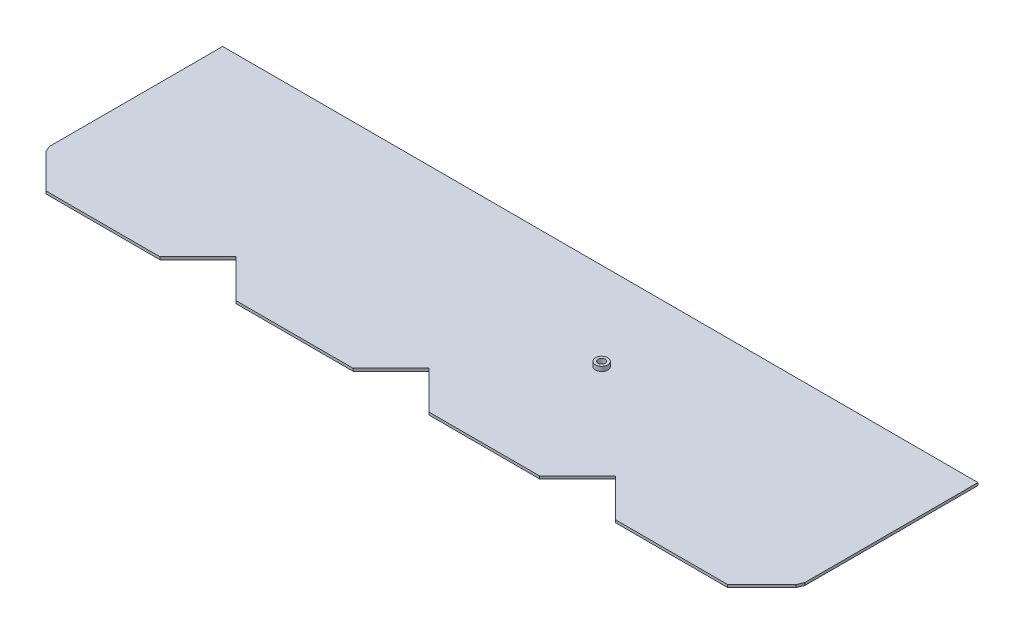
ISO-10303-21;
HEADER;
FILE_DESCRIPTION(('STEP AP214'),'2;1');
FILE_NAME('part.step','',(''),(''),'','','');
FILE_SCHEMA(('AUTOMOTIVE_DESIGN { 1 0 10303 214 1 1 1 1 }'));
ENDSEC;
DATA;
#1=APPLICATION_CONTEXT('core data for automotive mechanical design processes');
#2=APPLICATION_PROTOCOL_DEFINITION('international standard','automotive_design',2000,#1);
#3=PRODUCT_CONTEXT('',#1,'mechanical');
#4=PRODUCT('Part','Part','',(#3));
#5=PRODUCT_RELATED_PRODUCT_CATEGORY('part','',(#4));
#6=PRODUCT_DEFINITION_FORMATION('','',#4);
#7=PRODUCT_DEFINITION_CONTEXT('part definition',#1,'design');
#8=PRODUCT_DEFINITION('design','',#6,#7);
#9=PRODUCT_DEFINITION_SHAPE('','',#8);
#10=(LENGTH_UNIT() NAMED_UNIT(*) SI_UNIT(.MILLI.,.METRE.));
#11=(NAMED_UNIT(*) PLANE_ANGLE_UNIT() SI_UNIT($,.RADIAN.));
#12=(NAMED_UNIT(*) SI_UNIT($,.STERADIAN.) SOLID_ANGLE_UNIT());
#13=UNCERTAINTY_MEASURE_WITH_UNIT(LENGTH_MEASURE(1.E-05),#10,'distance_accuracy_value','');
#14=(GEOMETRIC_REPRESENTATION_CONTEXT(3) GLOBAL_UNCERTAINTY_ASSIGNED_CONTEXT((#13)) GLOBAL_UNIT_ASSIGNED_CONTEXT((#10,
#11,#12)) REPRESENTATION_CONTEXT('',''));
#15=CARTESIAN_POINT('',(0.,0.,0.));
#16=DIRECTION('',(0.,0.,1.));
#17=DIRECTION('',(1.,0.,0.));
#18=AXIS2_PLACEMENT_3D('',#15,#16,#17);
#19=CARTESIAN_POINT('',(0.,53.505408388521,50.));
#20=DIRECTION('',(0.,1.,0.));
#21=DIRECTION('',(0.,0.,1.));
#22=AXIS2_PLACEMENT_3D('',#19,#20,#21);
#23=PLANE('',#22);
#24=DIRECTION('',(-0.707106781186546,0.,0.707106781186549));
#25=VECTOR('',#24,1.);
#26=CARTESIAN_POINT('',(76.0160364478255,53.5054083885212,80.2466804827887));
#27=LINE('',#26,#25);
#28=CARTESIAN_POINT('',(107.044907195132,53.505408388521,49.2178097354824));
#29=VERTEX_POINT('',#28);
#30=CARTESIAN_POINT('',(96.4139605198139,53.505408388521,59.8487564108002));
#31=VERTEX_POINT('',#30);
#32=EDGE_CURVE('E473',#29,#31,#27,.T.);
#33=ORIENTED_EDGE('',*,*,#32,.F.);
#34=DIRECTION('',(-0.707106781186549,0.,-0.707106781186546));
#35=VECTOR('',#34,1.);
#36=CARTESIAN_POINT('',(112.79427374815,53.505408388521,54.9671762885009));
#37=LINE('',#36,#35);
#38=CARTESIAN_POINT('',(117.675853870449,53.505408388521,59.8487564107998));
#39=VERTEX_POINT('',#38);
#40=EDGE_CURVE('E414',#39,#29,#37,.T.);
#41=ORIENTED_EDGE('',*,*,#40,.F.);
#42=DIRECTION('',(1.,0.,0.));
#43=VECTOR('',#42,1.);
#44=CARTESIAN_POINT('',(107.912693625851,53.505408388521,59.8487564107998));
#45=LINE('',#44,#43);
#46=CARTESIAN_POINT('',(149.159335683654,53.505408388521,59.8487564107998));
#47=VERTEX_POINT('',#46);
#48=EDGE_CURVE('E417',#39,#47,#45,.T.);
#49=ORIENTED_EDGE('',*,*,#48,.T.);
#50=DIRECTION('',(-0.707106781186548,0.,0.707106781186547));
#51=VECTOR('',#50,1.);
#52=CARTESIAN_POINT('',(128.536014654753,53.5054083885211,80.4720774397011));
#53=LINE('',#52,#51);
#54=CARTESIAN_POINT('',(158.745719232882,53.505408388521,50.262372861486));
#55=VERTEX_POINT('',#54);
#56=EDGE_CURVE('E400',#55,#47,#53,.T.);
#57=ORIENTED_EDGE('',*,*,#56,.F.);
#58=DIRECTION('',(0.390683053656587,0.,-0.920525258526655));
#59=VECTOR('',#58,1.);
#60=CARTESIAN_POINT('',(158.745719232882,53.505408388521,50.262372861486));
#61=LINE('',#60,#59);
#62=CARTESIAN_POINT('',(159.482319232811,53.505408388521,48.5268000000092));
#63=VERTEX_POINT('',#62);
#64=EDGE_CURVE('E405',#55,#63,#61,.T.);
#65=ORIENTED_EDGE('',*,*,#64,.T.);
#66=DIRECTION('',(0.,0.,-1.));
#67=VECTOR('',#66,1.);
#68=CARTESIAN_POINT('',(159.482319232915,53.505408388521,49.9999999999994));
#69=LINE('',#68,#67);
#70=CARTESIAN_POINT('',(159.482319232915,53.505408388521,-6.52256026967279E-13));
#71=VERTEX_POINT('',#70);
#72=EDGE_CURVE('E403',#63,#71,#69,.T.);
#73=ORIENTED_EDGE('',*,*,#72,.T.);
#74=DIRECTION('',(1.,0.,0.));
#75=VECTOR('',#74,1.);
#76=CARTESIAN_POINT('',(54.144912375837,53.505408388521,-2.15105711021124E-13));
#77=LINE('',#76,#75);
#78=CARTESIAN_POINT('',(-52.2945812499967,53.505408388521,0.));
#79=VERTEX_POINT('',#78);
#80=EDGE_CURVE('E229',#79,#71,#77,.T.);
#81=ORIENTED_EDGE('',*,*,#80,.F.);
#82=DIRECTION('',(0.,0.,-1.));
#83=VECTOR('',#82,1.);
#84=CARTESIAN_POINT('',(-52.2945812499967,53.505408388521,50.));
#85=LINE('',#84,#83);
#86=CARTESIAN_POINT('',(-52.2945812500044,53.505408388521,48.5268000000098));
#87=VERTEX_POINT('',#86);
#88=EDGE_CURVE('E446',#87,#79,#85,.T.);
#89=ORIENTED_EDGE('',*,*,#88,.F.);
#90=DIRECTION('',(0.390683053641917,0.,0.920525258532881));
#91=VECTOR('',#90,1.);
#92=CARTESIAN_POINT('',(-52.2945812500044,53.505408388521,48.5268000000099));
#93=LINE('',#92,#91);
#94=CARTESIAN_POINT('',(-51.5579812501082,53.505408388521,50.2623728614867));
#95=VERTEX_POINT('',#94);
#96=EDGE_CURVE('E449',#87,#95,#93,.T.);
#97=ORIENTED_EDGE('',*,*,#96,.T.);
#98=DIRECTION('',(-0.707106781186547,0.,-0.707106781186548));
#99=VECTOR('',#98,1.);
#100=CARTESIAN_POINT('',(-47.1330894753917,53.505408388521,54.6872646361954));
#101=LINE('',#100,#99);
#102=CARTESIAN_POINT('',(-41.9715977007867,53.505408388521,59.8487564108004));
#103=VERTEX_POINT('',#102);
#104=EDGE_CURVE('E466',#103,#95,#101,.T.);
#105=ORIENTED_EDGE('',*,*,#104,.F.);
#106=DIRECTION('',(1.,0.,0.));
#107=VECTOR('',#106,1.);
#108=CARTESIAN_POINT('',(-52.2945812499967,53.505408388521,59.8487564108004));
#109=LINE('',#108,#107);
#110=CARTESIAN_POINT('',(-10.0255331060495,53.505408388521,59.8487564108004));
#111=VERTEX_POINT('',#110);
#112=EDGE_CURVE('E458',#103,#111,#109,.T.);
#113=ORIENTED_EDGE('',*,*,#112,.T.);
#114=DIRECTION('',(-0.707106781186546,0.,0.707106781186549));
#115=VECTOR('',#114,1.);
#116=CARTESIAN_POINT('',(-31.160057178023,53.5054083885212,80.983280482774));
#117=LINE('',#116,#115);
#118=CARTESIAN_POINT('',(0.605413569294166,53.505408388521,49.2178097354568));
#119=VERTEX_POINT('',#118);
#120=EDGE_CURVE('E461',#119,#111,#117,.T.);
#121=ORIENTED_EDGE('',*,*,#120,.F.);
#122=DIRECTION('',(-0.707106781186549,0.,-0.707106781186546));
#123=VECTOR('',#122,1.);
#124=CARTESIAN_POINT('',(6.35478012231893,53.505408388521,54.9671762884815));
#125=LINE('',#124,#123);
#126=CARTESIAN_POINT('',(11.2363602446379,53.505408388521,59.8487564108004));
#127=VERTEX_POINT('',#126);
#128=EDGE_CURVE('E391',#127,#119,#125,.T.);
#129=ORIENTED_EDGE('',*,*,#128,.F.);
#130=DIRECTION('',(1.,0.,0.));
#131=VECTOR('',#130,1.);
#132=CARTESIAN_POINT('',(1.4732,53.505408388521,59.8487564108004));
#133=LINE('',#132,#131);
#134=CARTESIAN_POINT('',(44.1193792697845,53.505408388521,59.8487564108004));
#135=VERTEX_POINT('',#134);
#136=EDGE_CURVE('E435',#127,#135,#133,.T.);
#137=ORIENTED_EDGE('',*,*,#136,.T.);
#138=DIRECTION('',(-0.707106781186544,0.,0.707106781186551));
#139=VECTOR('',#138,1.);
#140=CARTESIAN_POINT('',(22.7962896348924,53.5054083885212,81.1718460456927));
#141=LINE('',#140,#139);
#142=CARTESIAN_POINT('',(54.7503259451096,53.505408388521,49.2178097354752));
#143=VERTEX_POINT('',#142);
#144=EDGE_CURVE('E433',#143,#135,#141,.T.);
#145=ORIENTED_EDGE('',*,*,#144,.F.);
#146=DIRECTION('',(-0.707106781186551,0.,-0.707106781186544));
#147=VECTOR('',#146,1.);
#148=CARTESIAN_POINT('',(60.4996924981358,53.505408388521,54.9671762885014));
#149=LINE('',#148,#147);
#150=CARTESIAN_POINT('',(65.3812726204347,53.505408388521,59.8487564108002));
#151=VERTEX_POINT('',#150);
#152=EDGE_CURVE('E480',#151,#143,#149,.T.);
#153=ORIENTED_EDGE('',*,*,#152,.F.);
#154=DIRECTION('',(1.,0.,0.));
#155=VECTOR('',#154,1.);
#156=CARTESIAN_POINT('',(55.618112375837,53.505408388521,59.8487564108002));
#157=LINE('',#156,#155);
#158=EDGE_CURVE('E483',#151,#31,#157,.T.);
#159=ORIENTED_EDGE('',*,*,#158,.T.);
#160=EDGE_LOOP('',(#33,#41,#49,#57,#65,#73,#81,#89,#97,#105,#113,#121,#129,#137,#145,#153,#159));
#161=FACE_BOUND('',#160,.T.);
#162=CARTESIAN_POINT('',(78.5376608797119,53.505408388521,24.5770176248354));
#163=DIRECTION('',(0.,1.,0.));
#164=DIRECTION('',(0.,0.,-1.));
#165=AXIS2_PLACEMENT_3D('',#162,#163,#164);
#166=CIRCLE('',#165,1.7366);
#167=CARTESIAN_POINT('',(78.5376608797119,53.505408388521,22.8404176248354));
#168=VERTEX_POINT('',#167);
#169=EDGE_CURVE('E491',#168,#168,#166,.F.);
#170=ORIENTED_EDGE('',*,*,#169,.T.);
#171=EDGE_LOOP('',(#170));
#172=FACE_BOUND('',#171,.T.);
#173=ADVANCED_FACE('F221',(#161,#172),#23,.T.);
#174=CARTESIAN_POINT('',(54.144912375837,52.768808388521,49.9999999999998));
#175=DIRECTION('',(0.,1.,0.));
#176=DIRECTION('',(0.,0.,-1.));
#177=AXIS2_PLACEMENT_3D('',#174,#175,#176);
#178=PLANE('',#177);
#179=DIRECTION('',(-0.707106781186549,0.,-0.707106781186546));
#180=VECTOR('',#179,1.);
#181=CARTESIAN_POINT('',(112.79427374815,52.768808388521,54.9671762885009));
#182=LINE('',#181,#180);
#183=CARTESIAN_POINT('',(117.675853870449,52.768808388521,59.8487564107998));
#184=VERTEX_POINT('',#183);
#185=CARTESIAN_POINT('',(107.044907195132,52.768808388521,49.2178097354824));
#186=VERTEX_POINT('',#185);
#187=EDGE_CURVE('E352',#184,#186,#182,.T.);
#188=ORIENTED_EDGE('',*,*,#187,.T.);
#189=DIRECTION('',(-0.707106781186546,0.,0.707106781186549));
#190=VECTOR('',#189,1.);
#191=CARTESIAN_POINT('',(76.0160364478255,52.7688083885212,80.2466804827887));
#192=LINE('',#191,#190);
#193=CARTESIAN_POINT('',(96.4139605198139,52.7688083885211,59.8487564108002));
#194=VERTEX_POINT('',#193);
#195=EDGE_CURVE('E478',#186,#194,#192,.T.);
#196=ORIENTED_EDGE('',*,*,#195,.T.);
#197=DIRECTION('',(1.,0.,0.));
#198=VECTOR('',#197,1.);
#199=CARTESIAN_POINT('',(55.618112375837,52.768808388521,59.8487564108002));
#200=LINE('',#199,#198);
#201=CARTESIAN_POINT('',(65.3812726204347,52.768808388521,59.8487564108002));
#202=VERTEX_POINT('',#201);
#203=EDGE_CURVE('E485',#202,#194,#200,.T.);
#204=ORIENTED_EDGE('',*,*,#203,.F.);
#205=DIRECTION('',(-0.707106781186551,0.,-0.707106781186544));
#206=VECTOR('',#205,1.);
#207=CARTESIAN_POINT('',(60.4996924981358,52.768808388521,54.9671762885014));
#208=LINE('',#207,#206);
#209=CARTESIAN_POINT('',(54.7503259451096,52.768808388521,49.2178097354752));
#210=VERTEX_POINT('',#209);
#211=EDGE_CURVE('E475',#202,#210,#208,.T.);
#212=ORIENTED_EDGE('',*,*,#211,.T.);
#213=DIRECTION('',(-0.707106781186544,0.,0.707106781186551));
#214=VECTOR('',#213,1.);
#215=CARTESIAN_POINT('',(22.7962896348924,52.7688083885212,81.1718460456927));
#216=LINE('',#215,#214);
#217=CARTESIAN_POINT('',(44.1193792697845,52.7688083885211,59.8487564108004));
#218=VERTEX_POINT('',#217);
#219=EDGE_CURVE('E386',#210,#218,#216,.T.);
#220=ORIENTED_EDGE('',*,*,#219,.T.);
#221=DIRECTION('',(1.,0.,0.));
#222=VECTOR('',#221,1.);
#223=CARTESIAN_POINT('',(1.4732,52.768808388521,59.8487564108004));
#224=LINE('',#223,#222);
#225=CARTESIAN_POINT('',(11.2363602446379,52.768808388521,59.8487564108004));
#226=VERTEX_POINT('',#225);
#227=EDGE_CURVE('E383',#226,#218,#224,.T.);
#228=ORIENTED_EDGE('',*,*,#227,.F.);
#229=DIRECTION('',(-0.707106781186549,0.,-0.707106781186546));
#230=VECTOR('',#229,1.);
#231=CARTESIAN_POINT('',(6.35478012231893,52.768808388521,54.9671762884815));
#232=LINE('',#231,#230);
#233=CARTESIAN_POINT('',(0.605413569294166,52.768808388521,49.2178097354568));
#234=VERTEX_POINT('',#233);
#235=EDGE_CURVE('E379',#226,#234,#232,.T.);
#236=ORIENTED_EDGE('',*,*,#235,.T.);
#237=DIRECTION('',(-0.707106781186546,0.,0.707106781186549));
#238=VECTOR('',#237,1.);
#239=CARTESIAN_POINT('',(-31.160057178023,52.7688083885212,80.983280482774));
#240=LINE('',#239,#238);
#241=CARTESIAN_POINT('',(-10.0255331060495,52.768808388521,59.8487564108004));
#242=VERTEX_POINT('',#241);
#243=EDGE_CURVE('E368',#234,#242,#240,.T.);
#244=ORIENTED_EDGE('',*,*,#243,.T.);
#245=DIRECTION('',(1.,0.,0.));
#246=VECTOR('',#245,1.);
#247=CARTESIAN_POINT('',(-52.2945812499967,52.768808388521,59.8487564108004));
#248=LINE('',#247,#246);
#249=CARTESIAN_POINT('',(-41.9715977007867,52.768808388521,59.8487564108004));
#250=VERTEX_POINT('',#249);
#251=EDGE_CURVE('E468',#250,#242,#248,.T.);
#252=ORIENTED_EDGE('',*,*,#251,.F.);
#253=DIRECTION('',(-0.707106781186547,0.,-0.707106781186548));
#254=VECTOR('',#253,1.);
#255=CARTESIAN_POINT('',(-47.1330894753917,52.768808388521,54.6872646361954));
#256=LINE('',#255,#254);
#257=CARTESIAN_POINT('',(-51.5579812501004,52.768808388521,50.2623728614867));
#258=VERTEX_POINT('',#257);
#259=EDGE_CURVE('E374',#250,#258,#256,.T.);
#260=ORIENTED_EDGE('',*,*,#259,.T.);
#261=DIRECTION('',(0.390683053641917,0.,0.920525258532881));
#262=VECTOR('',#261,1.);
#263=CARTESIAN_POINT('',(-52.2945812500044,52.768808388521,48.5268000000099));
#264=LINE('',#263,#262);
#265=CARTESIAN_POINT('',(-52.2945812500044,52.768808388521,48.5268000000098));
#266=VERTEX_POINT('',#265);
#267=EDGE_CURVE('E453',#266,#258,#264,.T.);
#268=ORIENTED_EDGE('',*,*,#267,.F.);
#269=DIRECTION('',(0.,0.,-1.));
#270=VECTOR('',#269,1.);
#271=CARTESIAN_POINT('',(-52.2945812499967,52.768808388521,50.));
#272=LINE('',#271,#270);
#273=CARTESIAN_POINT('',(-52.2945812499967,52.768808388521,0.));
#274=VERTEX_POINT('',#273);
#275=EDGE_CURVE('E440',#266,#274,#272,.T.);
#276=ORIENTED_EDGE('',*,*,#275,.T.);
#277=DIRECTION('',(-1.,0.,0.));
#278=VECTOR('',#277,1.);
#279=CARTESIAN_POINT('',(54.144912375837,52.768808388521,-2.15105711021124E-13));
#280=LINE('',#279,#278);
#281=CARTESIAN_POINT('',(159.482319232915,52.768808388521,-6.52256026967279E-13));
#282=VERTEX_POINT('',#281);
#283=EDGE_CURVE('E12',#274,#282,#280,.F.);
#284=ORIENTED_EDGE('',*,*,#283,.T.);
#285=DIRECTION('',(0.,0.,-1.));
#286=VECTOR('',#285,1.);
#287=CARTESIAN_POINT('',(159.482319232915,52.768808388521,49.9999999999994));
#288=LINE('',#287,#286);
#289=CARTESIAN_POINT('',(159.482319232811,52.768808388521,48.5268000000092));
#290=VERTEX_POINT('',#289);
#291=EDGE_CURVE('E408',#290,#282,#288,.T.);
#292=ORIENTED_EDGE('',*,*,#291,.F.);
#293=DIRECTION('',(0.390683053656587,0.,-0.920525258526655));
#294=VECTOR('',#293,1.);
#295=CARTESIAN_POINT('',(158.745719232882,52.768808388521,50.262372861486));
#296=LINE('',#295,#294);
#297=CARTESIAN_POINT('',(158.745719232968,52.768808388521,50.262372861486));
#298=VERTEX_POINT('',#297);
#299=EDGE_CURVE('E422',#298,#290,#296,.T.);
#300=ORIENTED_EDGE('',*,*,#299,.F.);
#301=DIRECTION('',(-0.707106781186548,0.,0.707106781186547));
#302=VECTOR('',#301,1.);
#303=CARTESIAN_POINT('',(128.536014654753,52.7688083885211,80.4720774397011));
#304=LINE('',#303,#302);
#305=CARTESIAN_POINT('',(149.159335683654,52.768808388521,59.8487564107998));
#306=VERTEX_POINT('',#305);
#307=EDGE_CURVE('E341',#298,#306,#304,.T.);
#308=ORIENTED_EDGE('',*,*,#307,.T.);
#309=DIRECTION('',(1.,0.,0.));
#310=VECTOR('',#309,1.);
#311=CARTESIAN_POINT('',(107.912693625851,52.768808388521,59.8487564107998));
#312=LINE('',#311,#310);
#313=EDGE_CURVE('E426',#184,#306,#312,.T.);
#314=ORIENTED_EDGE('',*,*,#313,.F.);
#315=EDGE_LOOP('',(#188,#196,#204,#212,#220,#228,#236,#244,#252,#260,#268,#276,#284,#292,#300,
#308,#314));
#316=FACE_BOUND('',#315,.T.);
#317=CARTESIAN_POINT('',(78.5376608797119,52.768808388521,24.5770176248354));
#318=DIRECTION('',(0.,1.,0.));
#319=DIRECTION('',(0.,0.,-1.));
#320=AXIS2_PLACEMENT_3D('',#317,#318,#319);
#321=CIRCLE('',#320,1.);
#322=CARTESIAN_POINT('',(78.5376608797119,52.768808388521,23.5770176248354));
#323=VERTEX_POINT('',#322);
#324=EDGE_CURVE('E496',#323,#323,#321,.T.);
#325=ORIENTED_EDGE('',*,*,#324,.T.);
#326=EDGE_LOOP('',(#325));
#327=FACE_BOUND('',#326,.T.);
#328=ADVANCED_FACE('F380',(#316,#327),#178,.F.);
#329=CARTESIAN_POINT('',(106.913720764358,52.032208388521,-2.15105711021124E-13));
#330=DIRECTION('',(0.,0.,-1.));
#331=DIRECTION('',(0.,-1.,0.));
#332=AXIS2_PLACEMENT_3D('',#329,#330,#331);
#333=PLANE('',#332);
#334=ORIENTED_EDGE('',*,*,#80,.T.);
#335=DIRECTION('',(0.,-1.,0.));
#336=VECTOR('',#335,1.);
#337=CARTESIAN_POINT('',(159.482319232915,53.505408388521,-6.52256026967279E-13));
#338=LINE('',#337,#336);
#339=EDGE_CURVE('E401',#71,#282,#338,.T.);
#340=ORIENTED_EDGE('',*,*,#339,.T.);
#341=ORIENTED_EDGE('',*,*,#283,.F.);
#342=DIRECTION('',(0.,1.,0.));
#343=VECTOR('',#342,1.);
#344=CARTESIAN_POINT('',(-52.2945812499967,52.768808388521,0.));
#345=LINE('',#344,#343);
#346=EDGE_CURVE('E385',#274,#79,#345,.T.);
#347=ORIENTED_EDGE('',*,*,#346,.T.);
#348=EDGE_LOOP('',(#334,#340,#341,#347));
#349=FACE_BOUND('',#348,.T.);
#350=ADVANCED_FACE('F504',(#349),#333,.T.);
#351=CARTESIAN_POINT('',(78.5376608797119,54.768808388521,24.5770176248354));
#352=DIRECTION('',(0.,-1.,0.));
#353=DIRECTION('',(0.,0.,1.));
#354=AXIS2_PLACEMENT_3D('',#351,#352,#353);
#355=CYLINDRICAL_SURFACE('',#354,1.);
#356=ORIENTED_EDGE('',*,*,#324,.F.);
#357=EDGE_LOOP('',(#356));
#358=FACE_BOUND('',#357,.T.);
#359=CARTESIAN_POINT('',(78.5376608797119,54.768808388521,24.5770176248354));
#360=DIRECTION('',(0.,1.,0.));
#361=DIRECTION('',(0.,0.,-1.));
#362=AXIS2_PLACEMENT_3D('',#359,#360,#361);
#363=CIRCLE('',#362,1.);
#364=CARTESIAN_POINT('',(78.5376608797119,54.768808388521,23.5770176248354));
#365=VERTEX_POINT('',#364);
#366=EDGE_CURVE('E488',#365,#365,#363,.T.);
#367=ORIENTED_EDGE('',*,*,#366,.T.);
#368=EDGE_LOOP('',(#367));
#369=FACE_BOUND('',#368,.T.);
#370=ADVANCED_FACE('F500',(#358,#369),#355,.F.);
#371=CARTESIAN_POINT('',(78.5376608797119,54.768808388521,24.5770176248354));
#372=DIRECTION('',(0.,-1.,0.));
#373=DIRECTION('',(0.,0.,1.));
#374=AXIS2_PLACEMENT_3D('',#371,#372,#373);
#375=PLANE('',#374);
#376=ORIENTED_EDGE('',*,*,#366,.F.);
#377=EDGE_LOOP('',(#376));
#378=FACE_BOUND('',#377,.T.);
#379=CARTESIAN_POINT('',(78.5376608797119,54.768808388521,24.5770176248354));
#380=DIRECTION('',(0.,-1.,0.));
#381=DIRECTION('',(0.,0.,1.));
#382=AXIS2_PLACEMENT_3D('',#379,#380,#381);
#383=CIRCLE('',#382,1.7366);
#384=CARTESIAN_POINT('',(78.5376608797119,54.768808388521,26.3136176248354));
#385=VERTEX_POINT('',#384);
#386=EDGE_CURVE('E472',#385,#385,#383,.F.);
#387=ORIENTED_EDGE('',*,*,#386,.T.);
#388=EDGE_LOOP('',(#387));
#389=FACE_BOUND('',#388,.T.);
#390=ADVANCED_FACE('F503',(#378,#389),#375,.F.);
#391=CARTESIAN_POINT('',(78.5376608797119,54.768808388521,24.5770176248354));
#392=DIRECTION('',(0.,-1.,0.));
#393=DIRECTION('',(0.,0.,1.));
#394=AXIS2_PLACEMENT_3D('',#391,#392,#393);
#395=CYLINDRICAL_SURFACE('',#394,1.7366);
#396=ORIENTED_EDGE('',*,*,#169,.F.);
#397=EDGE_LOOP('',(#396));
#398=FACE_BOUND('',#397,.T.);
#399=ORIENTED_EDGE('',*,*,#386,.F.);
#400=EDGE_LOOP('',(#399));
#401=FACE_BOUND('',#400,.T.);
#402=ADVANCED_FACE('F510',(#398,#401),#395,.T.);
#403=CARTESIAN_POINT('',(55.618112375837,53.505408388521,59.8487564108002));
#404=DIRECTION('',(0.,0.,-1.));
#405=DIRECTION('',(1.,0.,0.));
#406=AXIS2_PLACEMENT_3D('',#403,#404,#405);
#407=PLANE('',#406);
#408=DIRECTION('',(0.,-1.,0.));
#409=VECTOR('',#408,1.);
#410=CARTESIAN_POINT('',(96.4139605198139,53.505408388521,59.8487564108002));
#411=LINE('',#410,#409);
#412=EDGE_CURVE('E237',#31,#194,#411,.T.);
#413=ORIENTED_EDGE('',*,*,#412,.F.);
#414=ORIENTED_EDGE('',*,*,#158,.F.);
#415=DIRECTION('',(0.,-1.,0.));
#416=VECTOR('',#415,1.);
#417=CARTESIAN_POINT('',(65.3812726204347,53.505408388521,59.8487564108002));
#418=LINE('',#417,#416);
#419=EDGE_CURVE('E248',#151,#202,#418,.T.);
#420=ORIENTED_EDGE('',*,*,#419,.T.);
#421=ORIENTED_EDGE('',*,*,#203,.T.);
#422=EDGE_LOOP('',(#413,#414,#420,#421));
#423=FACE_BOUND('',#422,.T.);
#424=ADVANCED_FACE('F515',(#423),#407,.F.);
#425=CARTESIAN_POINT('',(60.4996924981358,53.505408388521,54.9671762885014));
#426=DIRECTION('',(-0.707106781186544,0.,0.707106781186551));
#427=DIRECTION('',(-0.707106781186551,0.,-0.707106781186544));
#428=AXIS2_PLACEMENT_3D('',#425,#426,#427);
#429=PLANE('',#428);
#430=ORIENTED_EDGE('',*,*,#419,.F.);
#431=ORIENTED_EDGE('',*,*,#152,.T.);
#432=DIRECTION('',(0.,1.,0.));
#433=VECTOR('',#432,1.);
#434=CARTESIAN_POINT('',(54.7503259451096,52.768808388521,49.2178097354752));
#435=LINE('',#434,#433);
#436=EDGE_CURVE('E392',#210,#143,#435,.T.);
#437=ORIENTED_EDGE('',*,*,#436,.F.);
#438=ORIENTED_EDGE('',*,*,#211,.F.);
#439=EDGE_LOOP('',(#430,#431,#437,#438));
#440=FACE_BOUND('',#439,.T.);
#441=ADVANCED_FACE('F521',(#440),#429,.T.);
#442=CARTESIAN_POINT('',(76.0160364478255,53.5054083885212,80.2466804827887));
#443=DIRECTION('',(0.707106781186549,0.,0.707106781186546));
#444=DIRECTION('',(-0.707106781186546,0.,0.707106781186549));
#445=AXIS2_PLACEMENT_3D('',#442,#443,#444);
#446=PLANE('',#445);
#447=ORIENTED_EDGE('',*,*,#32,.T.);
#448=ORIENTED_EDGE('',*,*,#412,.T.);
#449=ORIENTED_EDGE('',*,*,#195,.F.);
#450=DIRECTION('',(0.,1.,0.));
#451=VECTOR('',#450,1.);
#452=CARTESIAN_POINT('',(107.044907195132,52.768808388521,49.2178097354824));
#453=LINE('',#452,#451);
#454=EDGE_CURVE('E395',#186,#29,#453,.T.);
#455=ORIENTED_EDGE('',*,*,#454,.T.);
#456=EDGE_LOOP('',(#447,#448,#449,#455));
#457=FACE_BOUND('',#456,.T.);
#458=ADVANCED_FACE('F538',(#457),#446,.T.);
#459=CARTESIAN_POINT('',(-52.2945812499967,53.505408388521,59.8487564108004));
#460=DIRECTION('',(0.,0.,-1.));
#461=DIRECTION('',(1.,0.,0.));
#462=AXIS2_PLACEMENT_3D('',#459,#460,#461);
#463=PLANE('',#462);
#464=DIRECTION('',(0.,-1.,0.));
#465=VECTOR('',#464,1.);
#466=CARTESIAN_POINT('',(-10.0255331060495,53.505408388521,59.8487564108004));
#467=LINE('',#466,#465);
#468=EDGE_CURVE('E304',#111,#242,#467,.T.);
#469=ORIENTED_EDGE('',*,*,#468,.F.);
#470=ORIENTED_EDGE('',*,*,#112,.F.);
#471=DIRECTION('',(0.,-1.,0.));
#472=VECTOR('',#471,1.);
#473=CARTESIAN_POINT('',(-41.9715977007867,53.505408388521,59.8487564108004));
#474=LINE('',#473,#472);
#475=EDGE_CURVE('E300',#103,#250,#474,.T.);
#476=ORIENTED_EDGE('',*,*,#475,.T.);
#477=ORIENTED_EDGE('',*,*,#251,.T.);
#478=EDGE_LOOP('',(#469,#470,#476,#477));
#479=FACE_BOUND('',#478,.T.);
#480=ADVANCED_FACE('F561',(#479),#463,.F.);
#481=CARTESIAN_POINT('',(-47.1330894753917,53.505408388521,54.6872646361954));
#482=DIRECTION('',(-0.707106781186548,0.,0.707106781186547));
#483=DIRECTION('',(-0.707106781186547,0.,-0.707106781186548));
#484=AXIS2_PLACEMENT_3D('',#481,#482,#483);
#485=PLANE('',#484);
#486=ORIENTED_EDGE('',*,*,#475,.F.);
#487=ORIENTED_EDGE('',*,*,#104,.T.);
#488=DIRECTION('',(0.,-1.,0.));
#489=VECTOR('',#488,1.);
#490=CARTESIAN_POINT('',(-51.5579812501004,53.505408388521,50.2623728614867));
#491=LINE('',#490,#489);
#492=EDGE_CURVE('E375',#95,#258,#491,.T.);
#493=ORIENTED_EDGE('',*,*,#492,.T.);
#494=ORIENTED_EDGE('',*,*,#259,.F.);
#495=EDGE_LOOP('',(#486,#487,#493,#494));
#496=FACE_BOUND('',#495,.T.);
#497=ADVANCED_FACE('F565',(#496),#485,.T.);
#498=CARTESIAN_POINT('',(-31.160057178023,53.5054083885212,80.983280482774));
#499=DIRECTION('',(0.707106781186549,0.,0.707106781186546));
#500=DIRECTION('',(-0.707106781186546,0.,0.707106781186549));
#501=AXIS2_PLACEMENT_3D('',#498,#499,#500);
#502=PLANE('',#501);
#503=ORIENTED_EDGE('',*,*,#120,.T.);
#504=ORIENTED_EDGE('',*,*,#468,.T.);
#505=ORIENTED_EDGE('',*,*,#243,.F.);
#506=DIRECTION('',(0.,1.,0.));
#507=VECTOR('',#506,1.);
#508=CARTESIAN_POINT('',(0.605413569294166,52.768808388521,49.2178097354568));
#509=LINE('',#508,#507);
#510=EDGE_CURVE('E373',#234,#119,#509,.T.);
#511=ORIENTED_EDGE('',*,*,#510,.T.);
#512=EDGE_LOOP('',(#503,#504,#505,#511));
#513=FACE_BOUND('',#512,.T.);
#514=ADVANCED_FACE('F371',(#513),#502,.T.);
#515=CARTESIAN_POINT('',(-52.2945812500044,53.137108388521,48.5268000000099));
#516=DIRECTION('',(-0.920525258532881,0.,0.390683053641917));
#517=DIRECTION('',(0.390683053641917,0.,0.920525258532881));
#518=AXIS2_PLACEMENT_3D('',#515,#516,#517);
#519=PLANE('',#518);
#520=DIRECTION('',(0.,-1.,0.));
#521=VECTOR('',#520,1.);
#522=CARTESIAN_POINT('',(-52.2945812500044,53.505408388521,48.5268000000098));
#523=LINE('',#522,#521);
#524=EDGE_CURVE('E456',#87,#266,#523,.T.);
#525=ORIENTED_EDGE('',*,*,#524,.T.);
#526=ORIENTED_EDGE('',*,*,#267,.T.);
#527=ORIENTED_EDGE('',*,*,#492,.F.);
#528=ORIENTED_EDGE('',*,*,#96,.F.);
#529=EDGE_LOOP('',(#525,#526,#527,#528));
#530=FACE_BOUND('',#529,.T.);
#531=ADVANCED_FACE('F578',(#530),#519,.T.);
#532=CARTESIAN_POINT('',(6.35478012231893,53.505408388521,54.9671762884815));
#533=DIRECTION('',(-0.707106781186546,0.,0.707106781186549));
#534=DIRECTION('',(-0.707106781186549,0.,-0.707106781186546));
#535=AXIS2_PLACEMENT_3D('',#532,#533,#534);
#536=PLANE('',#535);
#537=DIRECTION('',(0.,-1.,0.));
#538=VECTOR('',#537,1.);
#539=CARTESIAN_POINT('',(11.2363602446379,53.505408388521,59.8487564108004));
#540=LINE('',#539,#538);
#541=EDGE_CURVE('E444',#127,#226,#540,.T.);
#542=ORIENTED_EDGE('',*,*,#541,.F.);
#543=ORIENTED_EDGE('',*,*,#128,.T.);
#544=ORIENTED_EDGE('',*,*,#510,.F.);
#545=ORIENTED_EDGE('',*,*,#235,.F.);
#546=EDGE_LOOP('',(#542,#543,#544,#545));
#547=FACE_BOUND('',#546,.T.);
#548=ADVANCED_FACE('F389',(#547),#536,.T.);
#549=CARTESIAN_POINT('',(-52.2945812499967,52.768808388521,50.));
#550=DIRECTION('',(-1.,0.,0.));
#551=DIRECTION('',(0.,0.,-1.));
#552=AXIS2_PLACEMENT_3D('',#549,#550,#551);
#553=PLANE('',#552);
#554=ORIENTED_EDGE('',*,*,#275,.F.);
#555=ORIENTED_EDGE('',*,*,#524,.F.);
#556=ORIENTED_EDGE('',*,*,#88,.T.);
#557=ORIENTED_EDGE('',*,*,#346,.F.);
#558=EDGE_LOOP('',(#554,#555,#556,#557));
#559=FACE_BOUND('',#558,.T.);
#560=ADVANCED_FACE('F547',(#559),#553,.T.);
#561=CARTESIAN_POINT('',(1.4732,53.505408388521,59.8487564108004));
#562=DIRECTION('',(0.,0.,-1.));
#563=DIRECTION('',(1.,0.,0.));
#564=AXIS2_PLACEMENT_3D('',#561,#562,#563);
#565=PLANE('',#564);
#566=DIRECTION('',(0.,-1.,0.));
#567=VECTOR('',#566,1.);
#568=CARTESIAN_POINT('',(44.1193792697845,53.505408388521,59.8487564108004));
#569=LINE('',#568,#567);
#570=EDGE_CURVE('E259',#135,#218,#569,.T.);
#571=ORIENTED_EDGE('',*,*,#570,.F.);
#572=ORIENTED_EDGE('',*,*,#136,.F.);
#573=ORIENTED_EDGE('',*,*,#541,.T.);
#574=ORIENTED_EDGE('',*,*,#227,.T.);
#575=EDGE_LOOP('',(#571,#572,#573,#574));
#576=FACE_BOUND('',#575,.T.);
#577=ADVANCED_FACE('F545',(#576),#565,.F.);
#578=CARTESIAN_POINT('',(22.7962896348924,53.5054083885212,81.1718460456927));
#579=DIRECTION('',(0.707106781186551,0.,0.707106781186544));
#580=DIRECTION('',(-0.707106781186544,0.,0.707106781186551));
#581=AXIS2_PLACEMENT_3D('',#578,#579,#580);
#582=PLANE('',#581);
#583=ORIENTED_EDGE('',*,*,#144,.T.);
#584=ORIENTED_EDGE('',*,*,#570,.T.);
#585=ORIENTED_EDGE('',*,*,#219,.F.);
#586=ORIENTED_EDGE('',*,*,#436,.T.);
#587=EDGE_LOOP('',(#583,#584,#585,#586));
#588=FACE_BOUND('',#587,.T.);
#589=ADVANCED_FACE('F542',(#588),#582,.T.);
#590=CARTESIAN_POINT('',(128.536014654753,53.5054083885211,80.4720774397011));
#591=DIRECTION('',(0.707106781186547,0.,0.707106781186548));
#592=DIRECTION('',(-0.707106781186548,0.,0.707106781186547));
#593=AXIS2_PLACEMENT_3D('',#590,#591,#592);
#594=PLANE('',#593);
#595=ORIENTED_EDGE('',*,*,#56,.T.);
#596=DIRECTION('',(0.,-1.,0.));
#597=VECTOR('',#596,1.);
#598=CARTESIAN_POINT('',(149.159335683654,53.505408388521,59.8487564107998));
#599=LINE('',#598,#597);
#600=EDGE_CURVE('E345',#47,#306,#599,.T.);
#601=ORIENTED_EDGE('',*,*,#600,.T.);
#602=ORIENTED_EDGE('',*,*,#307,.F.);
#603=DIRECTION('',(0.,-1.,0.));
#604=VECTOR('',#603,1.);
#605=CARTESIAN_POINT('',(158.745719232968,53.505408388521,50.262372861486));
#606=LINE('',#605,#604);
#607=EDGE_CURVE('E420',#55,#298,#606,.T.);
#608=ORIENTED_EDGE('',*,*,#607,.F.);
#609=EDGE_LOOP('',(#595,#601,#602,#608));
#610=FACE_BOUND('',#609,.T.);
#611=ADVANCED_FACE('F553',(#610),#594,.T.);
#612=CARTESIAN_POINT('',(107.912693625851,53.505408388521,59.8487564107998));
#613=DIRECTION('',(0.,0.,-1.));
#614=DIRECTION('',(1.,0.,0.));
#615=AXIS2_PLACEMENT_3D('',#612,#613,#614);
#616=PLANE('',#615);
#617=ORIENTED_EDGE('',*,*,#600,.F.);
#618=ORIENTED_EDGE('',*,*,#48,.F.);
#619=DIRECTION('',(0.,-1.,0.));
#620=VECTOR('',#619,1.);
#621=CARTESIAN_POINT('',(117.675853870449,53.505408388521,59.8487564107998));
#622=LINE('',#621,#620);
#623=EDGE_CURVE('E428',#39,#184,#622,.T.);
#624=ORIENTED_EDGE('',*,*,#623,.T.);
#625=ORIENTED_EDGE('',*,*,#313,.T.);
#626=EDGE_LOOP('',(#617,#618,#624,#625));
#627=FACE_BOUND('',#626,.T.);
#628=ADVANCED_FACE('F612',(#627),#616,.F.);
#629=CARTESIAN_POINT('',(158.745719232882,53.137108388521,50.262372861486));
#630=DIRECTION('',(0.920525258526655,0.,0.390683053656587));
#631=DIRECTION('',(0.390683053656587,0.,-0.920525258526655));
#632=AXIS2_PLACEMENT_3D('',#629,#630,#631);
#633=PLANE('',#632);
#634=ORIENTED_EDGE('',*,*,#299,.T.);
#635=DIRECTION('',(0.,-1.,0.));
#636=VECTOR('',#635,1.);
#637=CARTESIAN_POINT('',(159.482319232811,53.505408388521,48.5268000000092));
#638=LINE('',#637,#636);
#639=EDGE_CURVE('E411',#63,#290,#638,.T.);
#640=ORIENTED_EDGE('',*,*,#639,.F.);
#641=ORIENTED_EDGE('',*,*,#64,.F.);
#642=ORIENTED_EDGE('',*,*,#607,.T.);
#643=EDGE_LOOP('',(#634,#640,#641,#642));
#644=FACE_BOUND('',#643,.T.);
#645=ADVANCED_FACE('F622',(#644),#633,.T.);
#646=CARTESIAN_POINT('',(112.79427374815,53.505408388521,54.9671762885009));
#647=DIRECTION('',(-0.707106781186546,0.,0.707106781186549));
#648=DIRECTION('',(-0.707106781186549,0.,-0.707106781186546));
#649=AXIS2_PLACEMENT_3D('',#646,#647,#648);
#650=PLANE('',#649);
#651=ORIENTED_EDGE('',*,*,#623,.F.);
#652=ORIENTED_EDGE('',*,*,#40,.T.);
#653=ORIENTED_EDGE('',*,*,#454,.F.);
#654=ORIENTED_EDGE('',*,*,#187,.F.);
#655=EDGE_LOOP('',(#651,#652,#653,#654));
#656=FACE_BOUND('',#655,.T.);
#657=ADVANCED_FACE('F537',(#656),#650,.T.);
#658=CARTESIAN_POINT('',(159.482319232915,53.505408388521,49.9999999999994));
#659=DIRECTION('',(1.,0.,0.));
#660=DIRECTION('',(0.,0.,1.));
#661=AXIS2_PLACEMENT_3D('',#658,#659,#660);
#662=PLANE('',#661);
#663=ORIENTED_EDGE('',*,*,#72,.F.);
#664=ORIENTED_EDGE('',*,*,#639,.T.);
#665=ORIENTED_EDGE('',*,*,#291,.T.);
#666=ORIENTED_EDGE('',*,*,#339,.F.);
#667=EDGE_LOOP('',(#663,#664,#665,#666));
#668=FACE_BOUND('',#667,.T.);
#669=ADVANCED_FACE('F573',(#668),#662,.T.);
#670=CLOSED_SHELL('',(#173,#328,#350,#370,#390,#402,#424,#441,#458,#480,#497,#514,#531,#548,
#560,#577,#589,#611,#628,#645,#657,#669));
#671=MANIFOLD_SOLID_BREP('B2',#670);
#672=ADVANCED_BREP_SHAPE_REPRESENTATION('',(#18,#671),#14);
#673=SHAPE_DEFINITION_REPRESENTATION(#9,#672);
ENDSEC;
END-ISO-10303-21;
